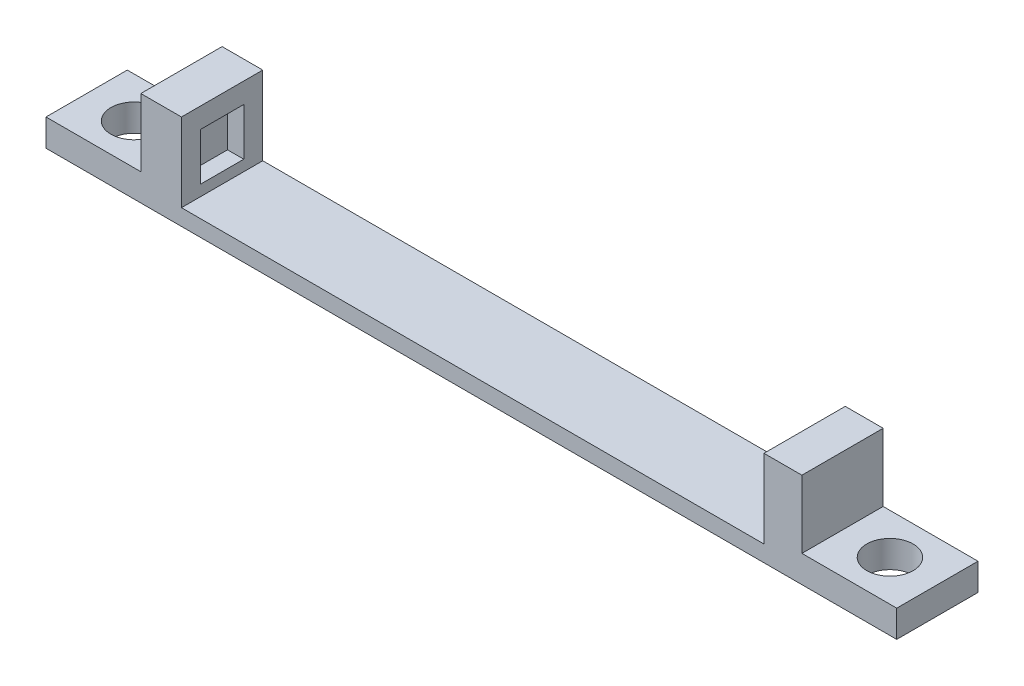
ISO-10303-21;
HEADER;
FILE_DESCRIPTION(('STEP AP214'),'2;1');
FILE_NAME('part.step','',(''),(''),'','','');
FILE_SCHEMA(('AUTOMOTIVE_DESIGN { 1 0 10303 214 1 1 1 1 }'));
ENDSEC;
DATA;
#1=APPLICATION_CONTEXT('core data for automotive mechanical design processes');
#2=APPLICATION_PROTOCOL_DEFINITION('international standard','automotive_design',2000,#1);
#3=PRODUCT_CONTEXT('',#1,'mechanical');
#4=PRODUCT('Part','Part','',(#3));
#5=PRODUCT_RELATED_PRODUCT_CATEGORY('part','',(#4));
#6=PRODUCT_DEFINITION_FORMATION('','',#4);
#7=PRODUCT_DEFINITION_CONTEXT('part definition',#1,'design');
#8=PRODUCT_DEFINITION('design','',#6,#7);
#9=PRODUCT_DEFINITION_SHAPE('','',#8);
#10=(LENGTH_UNIT() NAMED_UNIT(*) SI_UNIT(.MILLI.,.METRE.));
#11=(NAMED_UNIT(*) PLANE_ANGLE_UNIT() SI_UNIT($,.RADIAN.));
#12=(NAMED_UNIT(*) SI_UNIT($,.STERADIAN.) SOLID_ANGLE_UNIT());
#13=UNCERTAINTY_MEASURE_WITH_UNIT(LENGTH_MEASURE(1.E-05),#10,'distance_accuracy_value','');
#14=(GEOMETRIC_REPRESENTATION_CONTEXT(3) GLOBAL_UNCERTAINTY_ASSIGNED_CONTEXT((#13)) GLOBAL_UNIT_ASSIGNED_CONTEXT((#10,
#11,#12)) REPRESENTATION_CONTEXT('',''));
#15=CARTESIAN_POINT('',(0.,0.,0.));
#16=DIRECTION('',(0.,0.,1.));
#17=DIRECTION('',(1.,0.,0.));
#18=AXIS2_PLACEMENT_3D('',#15,#16,#17);
#19=CARTESIAN_POINT('',(53.3691636473072,1.524,5.87264658762612));
#20=DIRECTION('',(1.,0.,0.));
#21=DIRECTION('',(0.,0.,-1.));
#22=AXIS2_PLACEMENT_3D('',#19,#20,#21);
#23=PLANE('',#22);
#24=DIRECTION('',(0.,0.,-1.));
#25=VECTOR('',#24,1.);
#26=CARTESIAN_POINT('',(53.3691636473072,8.89,5.87264658762612));
#27=LINE('',#26,#25);
#28=CARTESIAN_POINT('',(53.3691636473072,8.89,13.4926465876261));
#29=VERTEX_POINT('',#28);
#30=CARTESIAN_POINT('',(53.3691636473072,8.89,5.87264658762612));
#31=VERTEX_POINT('',#30);
#32=EDGE_CURVE('E232',#29,#31,#27,.T.);
#33=ORIENTED_EDGE('',*,*,#32,.T.);
#34=DIRECTION('',(0.,1.,0.));
#35=VECTOR('',#34,1.);
#36=CARTESIAN_POINT('',(53.3691636473072,1.524,5.87264658762612));
#37=LINE('',#36,#35);
#38=CARTESIAN_POINT('',(53.3691636473072,1.524,5.87264658762612));
#39=VERTEX_POINT('',#38);
#40=EDGE_CURVE('E247',#39,#31,#37,.T.);
#41=ORIENTED_EDGE('',*,*,#40,.F.);
#42=DIRECTION('',(0.,0.,-1.));
#43=VECTOR('',#42,1.);
#44=CARTESIAN_POINT('',(53.3691636473072,1.524,5.87264658762612));
#45=LINE('',#44,#43);
#46=CARTESIAN_POINT('',(53.3691636473072,1.524,13.4926465876261));
#47=VERTEX_POINT('',#46);
#48=EDGE_CURVE('E235',#47,#39,#45,.T.);
#49=ORIENTED_EDGE('',*,*,#48,.F.);
#50=DIRECTION('',(0.,1.,0.));
#51=VECTOR('',#50,1.);
#52=CARTESIAN_POINT('',(53.3691636473072,1.524,13.4926465876261));
#53=LINE('',#52,#51);
#54=EDGE_CURVE('E250',#47,#29,#53,.T.);
#55=ORIENTED_EDGE('',*,*,#54,.T.);
#56=EDGE_LOOP('',(#33,#41,#49,#55));
#57=FACE_BOUND('',#56,.T.);
#58=DIRECTION('',(0.,-1.,0.));
#59=VECTOR('',#58,1.);
#60=CARTESIAN_POINT('',(53.3691636473072,6.985,7.84114658762612));
#61=LINE('',#60,#59);
#62=CARTESIAN_POINT('',(53.3691636473072,6.985,7.84114658762612));
#63=VERTEX_POINT('',#62);
#64=CARTESIAN_POINT('',(53.3691636473072,2.54,7.84114658762612));
#65=VERTEX_POINT('',#64);
#66=EDGE_CURVE('E189',#63,#65,#61,.T.);
#67=ORIENTED_EDGE('',*,*,#66,.F.);
#68=DIRECTION('',(0.,0.,-1.));
#69=VECTOR('',#68,1.);
#70=CARTESIAN_POINT('',(53.3691636473072,6.985,7.84114658762612));
#71=LINE('',#70,#69);
#72=CARTESIAN_POINT('',(53.3691636473072,6.985,11.5241465876261));
#73=VERTEX_POINT('',#72);
#74=EDGE_CURVE('E186',#73,#63,#71,.T.);
#75=ORIENTED_EDGE('',*,*,#74,.F.);
#76=DIRECTION('',(0.,1.,0.));
#77=VECTOR('',#76,1.);
#78=CARTESIAN_POINT('',(53.3691636473072,6.985,11.5241465876261));
#79=LINE('',#78,#77);
#80=CARTESIAN_POINT('',(53.3691636473072,2.54,11.5241465876261));
#81=VERTEX_POINT('',#80);
#82=EDGE_CURVE('E53',#81,#73,#79,.T.);
#83=ORIENTED_EDGE('',*,*,#82,.F.);
#84=DIRECTION('',(0.,0.,1.));
#85=VECTOR('',#84,1.);
#86=CARTESIAN_POINT('',(53.3691636473072,2.54,7.84114658762612));
#87=LINE('',#86,#85);
#88=EDGE_CURVE('E48',#65,#81,#87,.T.);
#89=ORIENTED_EDGE('',*,*,#88,.F.);
#90=EDGE_LOOP('',(#67,#75,#83,#89));
#91=FACE_BOUND('',#90,.T.);
#92=ADVANCED_FACE('F33',(#57,#91),#23,.F.);
#93=CARTESIAN_POINT('',(0.,8.89,0.));
#94=DIRECTION('',(0.,1.,0.));
#95=DIRECTION('',(0.,0.,1.));
#96=AXIS2_PLACEMENT_3D('',#93,#94,#95);
#97=PLANE('',#96);
#98=DIRECTION('',(0.,0.,1.));
#99=VECTOR('',#98,1.);
#100=CARTESIAN_POINT('',(-1.24083635269281,8.89,5.87264658762612));
#101=LINE('',#100,#99);
#102=CARTESIAN_POINT('',(-1.24083635269281,8.89,5.87264658762612));
#103=VERTEX_POINT('',#102);
#104=CARTESIAN_POINT('',(-1.2408363526928,8.89,13.4926465876261));
#105=VERTEX_POINT('',#104);
#106=EDGE_CURVE('E221',#103,#105,#101,.T.);
#107=ORIENTED_EDGE('',*,*,#106,.F.);
#108=DIRECTION('',(-1.,0.,0.));
#109=VECTOR('',#108,1.);
#110=CARTESIAN_POINT('',(-13.9408363526928,8.89,5.87264658762612));
#111=LINE('',#110,#109);
#112=CARTESIAN_POINT('',(-5.05083635269281,8.89,5.87264658762612));
#113=VERTEX_POINT('',#112);
#114=EDGE_CURVE('E293',#103,#113,#111,.T.);
#115=ORIENTED_EDGE('',*,*,#114,.T.);
#116=DIRECTION('',(0.,0.,-1.));
#117=VECTOR('',#116,1.);
#118=CARTESIAN_POINT('',(-5.05083635269281,8.89,5.87264658762612));
#119=LINE('',#118,#117);
#120=CARTESIAN_POINT('',(-5.05083635269281,8.89,13.4926465876261));
#121=VERTEX_POINT('',#120);
#122=EDGE_CURVE('E270',#121,#113,#119,.T.);
#123=ORIENTED_EDGE('',*,*,#122,.F.);
#124=DIRECTION('',(1.,0.,0.));
#125=VECTOR('',#124,1.);
#126=CARTESIAN_POINT('',(-13.9408363526928,8.89,13.4926465876261));
#127=LINE('',#126,#125);
#128=EDGE_CURVE('E290',#121,#105,#127,.T.);
#129=ORIENTED_EDGE('',*,*,#128,.T.);
#130=EDGE_LOOP('',(#107,#115,#123,#129));
#131=FACE_BOUND('',#130,.T.);
#132=ADVANCED_FACE('F358',(#131),#97,.T.);
#133=CARTESIAN_POINT('',(-13.9408363526928,8.89,5.87264658762612));
#134=DIRECTION('',(1.,0.,0.));
#135=DIRECTION('',(0.,0.,-1.));
#136=AXIS2_PLACEMENT_3D('',#133,#134,#135);
#137=PLANE('',#136);
#138=DIRECTION('',(0.,0.,1.));
#139=VECTOR('',#138,1.);
#140=CARTESIAN_POINT('',(-13.9408363526928,2.54,5.87264658762612));
#141=LINE('',#140,#139);
#142=CARTESIAN_POINT('',(-13.9408363526928,2.54,5.87264658762612));
#143=VERTEX_POINT('',#142);
#144=CARTESIAN_POINT('',(-13.9408363526928,2.54,13.4926465876261));
#145=VERTEX_POINT('',#144);
#146=EDGE_CURVE('E272',#143,#145,#141,.T.);
#147=ORIENTED_EDGE('',*,*,#146,.F.);
#148=DIRECTION('',(0.,-1.,0.));
#149=VECTOR('',#148,1.);
#150=CARTESIAN_POINT('',(-13.9408363526928,8.89,5.87264658762612));
#151=LINE('',#150,#149);
#152=CARTESIAN_POINT('',(-13.9408363526928,0.,5.87264658762612));
#153=VERTEX_POINT('',#152);
#154=EDGE_CURVE('E298',#143,#153,#151,.T.);
#155=ORIENTED_EDGE('',*,*,#154,.T.);
#156=DIRECTION('',(0.,0.,1.));
#157=VECTOR('',#156,1.);
#158=CARTESIAN_POINT('',(-13.9408363526928,0.,5.87264658762612));
#159=LINE('',#158,#157);
#160=CARTESIAN_POINT('',(-13.9408363526928,0.,13.4926465876261));
#161=VERTEX_POINT('',#160);
#162=EDGE_CURVE('E288',#153,#161,#159,.T.);
#163=ORIENTED_EDGE('',*,*,#162,.T.);
#164=DIRECTION('',(0.,-1.,0.));
#165=VECTOR('',#164,1.);
#166=CARTESIAN_POINT('',(-13.9408363526928,8.89,13.4926465876261));
#167=LINE('',#166,#165);
#168=EDGE_CURVE('E11',#145,#161,#167,.T.);
#169=ORIENTED_EDGE('',*,*,#168,.F.);
#170=EDGE_LOOP('',(#147,#155,#163,#169));
#171=FACE_BOUND('',#170,.T.);
#172=ADVANCED_FACE('F35',(#171),#137,.F.);
#173=CARTESIAN_POINT('',(-13.9408363526928,8.89,13.4926465876261));
#174=DIRECTION('',(0.,0.,-1.));
#175=DIRECTION('',(-1.,0.,0.));
#176=AXIS2_PLACEMENT_3D('',#173,#174,#175);
#177=PLANE('',#176);
#178=DIRECTION('',(1.,0.,0.));
#179=VECTOR('',#178,1.);
#180=CARTESIAN_POINT('',(-1.2408363526928,1.524,13.4926465876261));
#181=LINE('',#180,#179);
#182=CARTESIAN_POINT('',(-1.2408363526928,1.524,13.4926465876261));
#183=VERTEX_POINT('',#182);
#184=EDGE_CURVE('E231',#183,#47,#181,.T.);
#185=ORIENTED_EDGE('',*,*,#184,.F.);
#186=DIRECTION('',(0.,1.,0.));
#187=VECTOR('',#186,1.);
#188=CARTESIAN_POINT('',(-1.2408363526928,1.524,13.4926465876261));
#189=LINE('',#188,#187);
#190=EDGE_CURVE('E241',#183,#105,#189,.T.);
#191=ORIENTED_EDGE('',*,*,#190,.T.);
#192=ORIENTED_EDGE('',*,*,#128,.F.);
#193=DIRECTION('',(0.,1.,0.));
#194=VECTOR('',#193,1.);
#195=CARTESIAN_POINT('',(-5.05083635269281,2.54,13.4926465876261));
#196=LINE('',#195,#194);
#197=CARTESIAN_POINT('',(-5.05083635269281,2.54,13.4926465876261));
#198=VERTEX_POINT('',#197);
#199=EDGE_CURVE('E282',#198,#121,#196,.T.);
#200=ORIENTED_EDGE('',*,*,#199,.F.);
#201=DIRECTION('',(1.,0.,0.));
#202=VECTOR('',#201,1.);
#203=CARTESIAN_POINT('',(-13.9408363526928,2.54,13.4926465876261));
#204=LINE('',#203,#202);
#205=EDGE_CURVE('E274',#145,#198,#204,.T.);
#206=ORIENTED_EDGE('',*,*,#205,.F.);
#207=ORIENTED_EDGE('',*,*,#168,.T.);
#208=DIRECTION('',(1.,0.,0.));
#209=VECTOR('',#208,1.);
#210=CARTESIAN_POINT('',(-13.9408363526928,0.,13.4926465876261));
#211=LINE('',#210,#209);
#212=CARTESIAN_POINT('',(65.8151636473072,0.,13.4926465876261));
#213=VERTEX_POINT('',#212);
#214=EDGE_CURVE('E301',#161,#213,#211,.T.);
#215=ORIENTED_EDGE('',*,*,#214,.T.);
#216=DIRECTION('',(0.,-1.,0.));
#217=VECTOR('',#216,1.);
#218=CARTESIAN_POINT('',(65.8151636473072,8.89,13.4926465876261));
#219=LINE('',#218,#217);
#220=CARTESIAN_POINT('',(65.8151636473072,2.54,13.4926465876261));
#221=VERTEX_POINT('',#220);
#222=EDGE_CURVE('E41',#221,#213,#219,.T.);
#223=ORIENTED_EDGE('',*,*,#222,.F.);
#224=DIRECTION('',(1.,0.,0.));
#225=VECTOR('',#224,1.);
#226=CARTESIAN_POINT('',(65.8151636473072,2.54,13.4926465876261));
#227=LINE('',#226,#225);
#228=CARTESIAN_POINT('',(56.9251636473072,2.54,13.4926465876261));
#229=VERTEX_POINT('',#228);
#230=EDGE_CURVE('E262',#229,#221,#227,.T.);
#231=ORIENTED_EDGE('',*,*,#230,.F.);
#232=DIRECTION('',(0.,1.,0.));
#233=VECTOR('',#232,1.);
#234=CARTESIAN_POINT('',(56.9251636473072,2.54,13.4926465876261));
#235=LINE('',#234,#233);
#236=CARTESIAN_POINT('',(56.9251636473072,8.89,13.4926465876261));
#237=VERTEX_POINT('',#236);
#238=EDGE_CURVE('E267',#229,#237,#235,.T.);
#239=ORIENTED_EDGE('',*,*,#238,.T.);
#240=EDGE_CURVE('E294',#29,#237,#127,.T.);
#241=ORIENTED_EDGE('',*,*,#240,.F.);
#242=ORIENTED_EDGE('',*,*,#54,.F.);
#243=EDGE_LOOP('',(#185,#191,#192,#200,#206,#207,#215,#223,#231,#239,#241,#242));
#244=FACE_BOUND('',#243,.T.);
#245=ADVANCED_FACE('F323',(#244),#177,.F.);
#246=CARTESIAN_POINT('',(65.8151636473072,8.89,5.87264658762612));
#247=DIRECTION('',(-1.,0.,0.));
#248=DIRECTION('',(0.,0.,1.));
#249=AXIS2_PLACEMENT_3D('',#246,#247,#248);
#250=PLANE('',#249);
#251=DIRECTION('',(0.,-1.,0.));
#252=VECTOR('',#251,1.);
#253=CARTESIAN_POINT('',(65.8151636473072,8.89,5.87264658762612));
#254=LINE('',#253,#252);
#255=CARTESIAN_POINT('',(65.8151636473072,2.54,5.87264658762612));
#256=VERTEX_POINT('',#255);
#257=CARTESIAN_POINT('',(65.8151636473072,0.,5.87264658762612));
#258=VERTEX_POINT('',#257);
#259=EDGE_CURVE('E311',#256,#258,#254,.T.);
#260=ORIENTED_EDGE('',*,*,#259,.F.);
#261=DIRECTION('',(0.,0.,-1.));
#262=VECTOR('',#261,1.);
#263=CARTESIAN_POINT('',(65.8151636473072,2.54,5.87264658762612));
#264=LINE('',#263,#262);
#265=EDGE_CURVE('E254',#221,#256,#264,.T.);
#266=ORIENTED_EDGE('',*,*,#265,.F.);
#267=ORIENTED_EDGE('',*,*,#222,.T.);
#268=DIRECTION('',(0.,0.,-1.));
#269=VECTOR('',#268,1.);
#270=CARTESIAN_POINT('',(65.8151636473072,0.,5.87264658762612));
#271=LINE('',#270,#269);
#272=EDGE_CURVE('E304',#213,#258,#271,.T.);
#273=ORIENTED_EDGE('',*,*,#272,.T.);
#274=EDGE_LOOP('',(#260,#266,#267,#273));
#275=FACE_BOUND('',#274,.T.);
#276=ADVANCED_FACE('F316',(#275),#250,.F.);
#277=CARTESIAN_POINT('',(-13.9408363526928,8.89,5.87264658762612));
#278=DIRECTION('',(0.,0.,1.));
#279=DIRECTION('',(1.,0.,0.));
#280=AXIS2_PLACEMENT_3D('',#277,#278,#279);
#281=PLANE('',#280);
#282=ORIENTED_EDGE('',*,*,#114,.F.);
#283=DIRECTION('',(0.,1.,0.));
#284=VECTOR('',#283,1.);
#285=CARTESIAN_POINT('',(-1.24083635269281,1.524,5.87264658762612));
#286=LINE('',#285,#284);
#287=CARTESIAN_POINT('',(-1.24083635269281,1.524,5.87264658762612));
#288=VERTEX_POINT('',#287);
#289=EDGE_CURVE('E244',#288,#103,#286,.T.);
#290=ORIENTED_EDGE('',*,*,#289,.F.);
#291=DIRECTION('',(-1.,0.,0.));
#292=VECTOR('',#291,1.);
#293=CARTESIAN_POINT('',(-1.24083635269281,1.524,5.87264658762612));
#294=LINE('',#293,#292);
#295=EDGE_CURVE('E238',#39,#288,#294,.T.);
#296=ORIENTED_EDGE('',*,*,#295,.F.);
#297=ORIENTED_EDGE('',*,*,#40,.T.);
#298=CARTESIAN_POINT('',(56.9251636473072,8.89,5.87264658762612));
#299=VERTEX_POINT('',#298);
#300=EDGE_CURVE('E295',#299,#31,#111,.T.);
#301=ORIENTED_EDGE('',*,*,#300,.F.);
#302=DIRECTION('',(0.,1.,0.));
#303=VECTOR('',#302,1.);
#304=CARTESIAN_POINT('',(56.9251636473072,2.54,5.87264658762612));
#305=LINE('',#304,#303);
#306=CARTESIAN_POINT('',(56.9251636473072,2.54,5.87264658762612));
#307=VERTEX_POINT('',#306);
#308=EDGE_CURVE('E264',#307,#299,#305,.T.);
#309=ORIENTED_EDGE('',*,*,#308,.F.);
#310=DIRECTION('',(-1.,0.,0.));
#311=VECTOR('',#310,1.);
#312=CARTESIAN_POINT('',(65.8151636473072,2.54,5.87264658762612));
#313=LINE('',#312,#311);
#314=EDGE_CURVE('E256',#256,#307,#313,.T.);
#315=ORIENTED_EDGE('',*,*,#314,.F.);
#316=ORIENTED_EDGE('',*,*,#259,.T.);
#317=DIRECTION('',(-1.,0.,0.));
#318=VECTOR('',#317,1.);
#319=CARTESIAN_POINT('',(-13.9408363526928,0.,5.87264658762612));
#320=LINE('',#319,#318);
#321=EDGE_CURVE('E307',#258,#153,#320,.T.);
#322=ORIENTED_EDGE('',*,*,#321,.T.);
#323=ORIENTED_EDGE('',*,*,#154,.F.);
#324=DIRECTION('',(-1.,0.,0.));
#325=VECTOR('',#324,1.);
#326=CARTESIAN_POINT('',(-13.9408363526928,2.54,5.87264658762612));
#327=LINE('',#326,#325);
#328=CARTESIAN_POINT('',(-5.05083635269281,2.54,5.87264658762612));
#329=VERTEX_POINT('',#328);
#330=EDGE_CURVE('E280',#329,#143,#327,.T.);
#331=ORIENTED_EDGE('',*,*,#330,.F.);
#332=DIRECTION('',(0.,1.,0.));
#333=VECTOR('',#332,1.);
#334=CARTESIAN_POINT('',(-5.05083635269281,2.54,5.87264658762612));
#335=LINE('',#334,#333);
#336=EDGE_CURVE('E285',#329,#113,#335,.T.);
#337=ORIENTED_EDGE('',*,*,#336,.T.);
#338=EDGE_LOOP('',(#282,#290,#296,#297,#301,#309,#315,#316,#322,#323,#331,#337));
#339=FACE_BOUND('',#338,.T.);
#340=ADVANCED_FACE('F332',(#339),#281,.F.);
#341=ORIENTED_EDGE('',*,*,#32,.F.);
#342=ORIENTED_EDGE('',*,*,#240,.T.);
#343=DIRECTION('',(0.,0.,1.));
#344=VECTOR('',#343,1.);
#345=CARTESIAN_POINT('',(56.9251636473072,8.89,5.87264658762612));
#346=LINE('',#345,#344);
#347=EDGE_CURVE('E246',#299,#237,#346,.T.);
#348=ORIENTED_EDGE('',*,*,#347,.F.);
#349=ORIENTED_EDGE('',*,*,#300,.T.);
#350=EDGE_LOOP('',(#341,#342,#348,#349));
#351=FACE_BOUND('',#350,.T.);
#352=ADVANCED_FACE('F346',(#351),#97,.T.);
#353=CARTESIAN_POINT('',(0.,0.,0.));
#354=DIRECTION('',(0.,1.,0.));
#355=DIRECTION('',(0.,0.,1.));
#356=AXIS2_PLACEMENT_3D('',#353,#354,#355);
#357=PLANE('',#356);
#358=CARTESIAN_POINT('',(61.3701636473072,0.,9.68264658762611));
#359=DIRECTION('',(0.,1.,0.));
#360=DIRECTION('',(0.,0.,1.));
#361=AXIS2_PLACEMENT_3D('',#358,#359,#360);
#362=CIRCLE('',#361,2.17169999999999);
#363=CARTESIAN_POINT('',(61.3701636473072,0.,11.8543465876261));
#364=VERTEX_POINT('',#363);
#365=EDGE_CURVE('E596',#364,#364,#362,.T.);
#366=ORIENTED_EDGE('',*,*,#365,.T.);
#367=EDGE_LOOP('',(#366));
#368=FACE_BOUND('',#367,.T.);
#369=CARTESIAN_POINT('',(-9.49583635269281,0.,9.68264658762611));
#370=DIRECTION('',(0.,1.,0.));
#371=DIRECTION('',(0.,0.,1.));
#372=AXIS2_PLACEMENT_3D('',#369,#370,#371);
#373=CIRCLE('',#372,2.1717);
#374=CARTESIAN_POINT('',(-9.49583635269281,0.,11.8543465876261));
#375=VERTEX_POINT('',#374);
#376=EDGE_CURVE('E604',#375,#375,#373,.T.);
#377=ORIENTED_EDGE('',*,*,#376,.T.);
#378=EDGE_LOOP('',(#377));
#379=FACE_BOUND('',#378,.T.);
#380=ORIENTED_EDGE('',*,*,#162,.F.);
#381=ORIENTED_EDGE('',*,*,#321,.F.);
#382=ORIENTED_EDGE('',*,*,#272,.F.);
#383=ORIENTED_EDGE('',*,*,#214,.F.);
#384=EDGE_LOOP('',(#380,#381,#382,#383));
#385=FACE_BOUND('',#384,.T.);
#386=ADVANCED_FACE('F328',(#368,#379,#385),#357,.F.);
#387=CARTESIAN_POINT('',(-5.05083635269281,2.54,5.87264658762612));
#388=DIRECTION('',(1.,0.,0.));
#389=DIRECTION('',(0.,0.,-1.));
#390=AXIS2_PLACEMENT_3D('',#387,#388,#389);
#391=PLANE('',#390);
#392=ORIENTED_EDGE('',*,*,#122,.T.);
#393=ORIENTED_EDGE('',*,*,#336,.F.);
#394=DIRECTION('',(0.,0.,-1.));
#395=VECTOR('',#394,1.);
#396=CARTESIAN_POINT('',(-5.05083635269281,2.54,5.87264658762612));
#397=LINE('',#396,#395);
#398=EDGE_CURVE('E277',#198,#329,#397,.T.);
#399=ORIENTED_EDGE('',*,*,#398,.F.);
#400=ORIENTED_EDGE('',*,*,#199,.T.);
#401=EDGE_LOOP('',(#392,#393,#399,#400));
#402=FACE_BOUND('',#401,.T.);
#403=ADVANCED_FACE('F360',(#402),#391,.F.);
#404=CARTESIAN_POINT('',(0.,2.54,0.));
#405=DIRECTION('',(0.,1.,0.));
#406=DIRECTION('',(0.,0.,1.));
#407=AXIS2_PLACEMENT_3D('',#404,#405,#406);
#408=PLANE('',#407);
#409=CARTESIAN_POINT('',(-9.49583635269281,2.54,9.68264658762611));
#410=DIRECTION('',(0.,1.,0.));
#411=DIRECTION('',(0.,0.,1.));
#412=AXIS2_PLACEMENT_3D('',#409,#410,#411);
#413=CIRCLE('',#412,2.1717);
#414=CARTESIAN_POINT('',(-9.49583635269281,2.54,11.8543465876261));
#415=VERTEX_POINT('',#414);
#416=EDGE_CURVE('E601',#415,#415,#413,.T.);
#417=ORIENTED_EDGE('',*,*,#416,.F.);
#418=EDGE_LOOP('',(#417));
#419=FACE_BOUND('',#418,.T.);
#420=ORIENTED_EDGE('',*,*,#146,.T.);
#421=ORIENTED_EDGE('',*,*,#205,.T.);
#422=ORIENTED_EDGE('',*,*,#398,.T.);
#423=ORIENTED_EDGE('',*,*,#330,.T.);
#424=EDGE_LOOP('',(#420,#421,#422,#423));
#425=FACE_BOUND('',#424,.T.);
#426=ADVANCED_FACE('F363',(#419,#425),#408,.T.);
#427=CARTESIAN_POINT('',(56.9251636473072,2.54,5.87264658762612));
#428=DIRECTION('',(-1.,0.,0.));
#429=DIRECTION('',(0.,0.,1.));
#430=AXIS2_PLACEMENT_3D('',#427,#428,#429);
#431=PLANE('',#430);
#432=ORIENTED_EDGE('',*,*,#347,.T.);
#433=ORIENTED_EDGE('',*,*,#238,.F.);
#434=DIRECTION('',(0.,0.,1.));
#435=VECTOR('',#434,1.);
#436=CARTESIAN_POINT('',(56.9251636473072,2.54,5.87264658762612));
#437=LINE('',#436,#435);
#438=EDGE_CURVE('E259',#307,#229,#437,.T.);
#439=ORIENTED_EDGE('',*,*,#438,.F.);
#440=ORIENTED_EDGE('',*,*,#308,.T.);
#441=EDGE_LOOP('',(#432,#433,#439,#440));
#442=FACE_BOUND('',#441,.T.);
#443=ADVANCED_FACE('F342',(#442),#431,.F.);
#444=CARTESIAN_POINT('',(0.,2.54,0.));
#445=DIRECTION('',(0.,-1.,0.));
#446=DIRECTION('',(0.,0.,-1.));
#447=AXIS2_PLACEMENT_3D('',#444,#445,#446);
#448=PLANE('',#447);
#449=CARTESIAN_POINT('',(61.3701636473072,2.54,9.68264658762611));
#450=DIRECTION('',(0.,1.,0.));
#451=DIRECTION('',(0.,0.,1.));
#452=AXIS2_PLACEMENT_3D('',#449,#450,#451);
#453=CIRCLE('',#452,2.17169999999999);
#454=CARTESIAN_POINT('',(61.3701636473072,2.54,11.8543465876261));
#455=VERTEX_POINT('',#454);
#456=EDGE_CURVE('E599',#455,#455,#453,.T.);
#457=ORIENTED_EDGE('',*,*,#456,.F.);
#458=EDGE_LOOP('',(#457));
#459=FACE_BOUND('',#458,.T.);
#460=ORIENTED_EDGE('',*,*,#265,.T.);
#461=ORIENTED_EDGE('',*,*,#314,.T.);
#462=ORIENTED_EDGE('',*,*,#438,.T.);
#463=ORIENTED_EDGE('',*,*,#230,.T.);
#464=EDGE_LOOP('',(#460,#461,#462,#463));
#465=FACE_BOUND('',#464,.T.);
#466=ADVANCED_FACE('F338',(#459,#465),#448,.F.);
#467=CARTESIAN_POINT('',(-1.24083635269281,1.524,5.87264658762612));
#468=DIRECTION('',(-1.,0.,0.));
#469=DIRECTION('',(0.,0.,1.));
#470=AXIS2_PLACEMENT_3D('',#467,#468,#469);
#471=PLANE('',#470);
#472=DIRECTION('',(0.,0.,-1.));
#473=VECTOR('',#472,1.);
#474=CARTESIAN_POINT('',(-1.24083635269281,2.54,11.7146465876261));
#475=LINE('',#474,#473);
#476=CARTESIAN_POINT('',(-1.24083635269281,2.54,11.7146465876261));
#477=VERTEX_POINT('',#476);
#478=CARTESIAN_POINT('',(-1.24083635269281,2.54,7.65064658762611));
#479=VERTEX_POINT('',#478);
#480=EDGE_CURVE('E192',#477,#479,#475,.T.);
#481=ORIENTED_EDGE('',*,*,#480,.F.);
#482=DIRECTION('',(0.,-1.,0.));
#483=VECTOR('',#482,1.);
#484=CARTESIAN_POINT('',(-1.24083635269281,6.985,11.7146465876261));
#485=LINE('',#484,#483);
#486=CARTESIAN_POINT('',(-1.24083635269281,6.985,11.7146465876261));
#487=VERTEX_POINT('',#486);
#488=EDGE_CURVE('E190',#487,#477,#485,.T.);
#489=ORIENTED_EDGE('',*,*,#488,.F.);
#490=DIRECTION('',(0.,0.,1.));
#491=VECTOR('',#490,1.);
#492=CARTESIAN_POINT('',(-1.24083635269281,6.985,11.7146465876261));
#493=LINE('',#492,#491);
#494=CARTESIAN_POINT('',(-1.24083635269281,6.985,7.65064658762611));
#495=VERTEX_POINT('',#494);
#496=EDGE_CURVE('E202',#495,#487,#493,.T.);
#497=ORIENTED_EDGE('',*,*,#496,.F.);
#498=DIRECTION('',(0.,1.,0.));
#499=VECTOR('',#498,1.);
#500=CARTESIAN_POINT('',(-1.24083635269281,6.985,7.65064658762611));
#501=LINE('',#500,#499);
#502=EDGE_CURVE('E214',#479,#495,#501,.T.);
#503=ORIENTED_EDGE('',*,*,#502,.F.);
#504=EDGE_LOOP('',(#481,#489,#497,#503));
#505=FACE_BOUND('',#504,.T.);
#506=ORIENTED_EDGE('',*,*,#106,.T.);
#507=ORIENTED_EDGE('',*,*,#190,.F.);
#508=DIRECTION('',(0.,0.,1.));
#509=VECTOR('',#508,1.);
#510=CARTESIAN_POINT('',(-1.24083635269281,1.524,5.87264658762612));
#511=LINE('',#510,#509);
#512=EDGE_CURVE('E228',#288,#183,#511,.T.);
#513=ORIENTED_EDGE('',*,*,#512,.F.);
#514=ORIENTED_EDGE('',*,*,#289,.T.);
#515=EDGE_LOOP('',(#506,#507,#513,#514));
#516=FACE_BOUND('',#515,.T.);
#517=ADVANCED_FACE('F378',(#505,#516),#471,.F.);
#518=CARTESIAN_POINT('',(0.,1.524,0.));
#519=DIRECTION('',(0.,1.,0.));
#520=DIRECTION('',(0.,0.,1.));
#521=AXIS2_PLACEMENT_3D('',#518,#519,#520);
#522=PLANE('',#521);
#523=ORIENTED_EDGE('',*,*,#512,.T.);
#524=ORIENTED_EDGE('',*,*,#184,.T.);
#525=ORIENTED_EDGE('',*,*,#48,.T.);
#526=ORIENTED_EDGE('',*,*,#295,.T.);
#527=EDGE_LOOP('',(#523,#524,#525,#526));
#528=FACE_BOUND('',#527,.T.);
#529=ADVANCED_FACE('F351',(#528),#522,.T.);
#530=CARTESIAN_POINT('',(-2.76483635269281,6.985,11.7146465876261));
#531=DIRECTION('',(0.,0.,1.));
#532=DIRECTION('',(1.,0.,0.));
#533=AXIS2_PLACEMENT_3D('',#530,#531,#532);
#534=PLANE('',#533);
#535=ORIENTED_EDGE('',*,*,#488,.T.);
#536=DIRECTION('',(1.,0.,0.));
#537=VECTOR('',#536,1.);
#538=CARTESIAN_POINT('',(-2.76483635269281,2.54,11.7146465876261));
#539=LINE('',#538,#537);
#540=CARTESIAN_POINT('',(-2.76483635269281,2.54,11.7146465876261));
#541=VERTEX_POINT('',#540);
#542=EDGE_CURVE('E210',#541,#477,#539,.T.);
#543=ORIENTED_EDGE('',*,*,#542,.F.);
#544=DIRECTION('',(0.,-1.,0.));
#545=VECTOR('',#544,1.);
#546=CARTESIAN_POINT('',(-2.76483635269281,6.985,11.7146465876261));
#547=LINE('',#546,#545);
#548=CARTESIAN_POINT('',(-2.76483635269281,6.985,11.7146465876261));
#549=VERTEX_POINT('',#548);
#550=EDGE_CURVE('E198',#549,#541,#547,.T.);
#551=ORIENTED_EDGE('',*,*,#550,.F.);
#552=DIRECTION('',(1.,0.,0.));
#553=VECTOR('',#552,1.);
#554=CARTESIAN_POINT('',(-2.76483635269281,6.985,11.7146465876261));
#555=LINE('',#554,#553);
#556=EDGE_CURVE('E219',#549,#487,#555,.T.);
#557=ORIENTED_EDGE('',*,*,#556,.T.);
#558=EDGE_LOOP('',(#535,#543,#551,#557));
#559=FACE_BOUND('',#558,.T.);
#560=ADVANCED_FACE('F446',(#559),#534,.F.);
#561=CARTESIAN_POINT('',(-2.76483635269281,6.985,11.7146465876261));
#562=DIRECTION('',(0.,1.,0.));
#563=DIRECTION('',(0.,0.,1.));
#564=AXIS2_PLACEMENT_3D('',#561,#562,#563);
#565=PLANE('',#564);
#566=ORIENTED_EDGE('',*,*,#496,.T.);
#567=ORIENTED_EDGE('',*,*,#556,.F.);
#568=DIRECTION('',(0.,0.,1.));
#569=VECTOR('',#568,1.);
#570=CARTESIAN_POINT('',(-2.76483635269281,6.985,11.7146465876261));
#571=LINE('',#570,#569);
#572=CARTESIAN_POINT('',(-2.76483635269281,6.985,7.65064658762611));
#573=VERTEX_POINT('',#572);
#574=EDGE_CURVE('E208',#573,#549,#571,.T.);
#575=ORIENTED_EDGE('',*,*,#574,.F.);
#576=DIRECTION('',(1.,0.,0.));
#577=VECTOR('',#576,1.);
#578=CARTESIAN_POINT('',(-2.76483635269281,6.985,7.65064658762611));
#579=LINE('',#578,#577);
#580=EDGE_CURVE('E222',#573,#495,#579,.T.);
#581=ORIENTED_EDGE('',*,*,#580,.T.);
#582=EDGE_LOOP('',(#566,#567,#575,#581));
#583=FACE_BOUND('',#582,.T.);
#584=ADVANCED_FACE('F451',(#583),#565,.F.);
#585=CARTESIAN_POINT('',(-2.76483635269281,6.985,7.65064658762611));
#586=DIRECTION('',(0.,0.,-1.));
#587=DIRECTION('',(-1.,0.,0.));
#588=AXIS2_PLACEMENT_3D('',#585,#586,#587);
#589=PLANE('',#588);
#590=ORIENTED_EDGE('',*,*,#502,.T.);
#591=ORIENTED_EDGE('',*,*,#580,.F.);
#592=DIRECTION('',(0.,1.,0.));
#593=VECTOR('',#592,1.);
#594=CARTESIAN_POINT('',(-2.76483635269281,6.985,7.65064658762611));
#595=LINE('',#594,#593);
#596=CARTESIAN_POINT('',(-2.76483635269281,2.54,7.65064658762611));
#597=VERTEX_POINT('',#596);
#598=EDGE_CURVE('E205',#597,#573,#595,.T.);
#599=ORIENTED_EDGE('',*,*,#598,.F.);
#600=DIRECTION('',(1.,0.,0.));
#601=VECTOR('',#600,1.);
#602=CARTESIAN_POINT('',(-2.76483635269281,2.54,7.65064658762611));
#603=LINE('',#602,#601);
#604=EDGE_CURVE('E224',#597,#479,#603,.T.);
#605=ORIENTED_EDGE('',*,*,#604,.T.);
#606=EDGE_LOOP('',(#590,#591,#599,#605));
#607=FACE_BOUND('',#606,.T.);
#608=ADVANCED_FACE('F458',(#607),#589,.F.);
#609=CARTESIAN_POINT('',(-2.76483635269281,2.54,11.7146465876261));
#610=DIRECTION('',(0.,-1.,0.));
#611=DIRECTION('',(0.,0.,-1.));
#612=AXIS2_PLACEMENT_3D('',#609,#610,#611);
#613=PLANE('',#612);
#614=ORIENTED_EDGE('',*,*,#480,.T.);
#615=ORIENTED_EDGE('',*,*,#604,.F.);
#616=DIRECTION('',(0.,0.,-1.));
#617=VECTOR('',#616,1.);
#618=CARTESIAN_POINT('',(-2.76483635269281,2.54,11.7146465876261));
#619=LINE('',#618,#617);
#620=EDGE_CURVE('E201',#541,#597,#619,.T.);
#621=ORIENTED_EDGE('',*,*,#620,.F.);
#622=ORIENTED_EDGE('',*,*,#542,.T.);
#623=EDGE_LOOP('',(#614,#615,#621,#622));
#624=FACE_BOUND('',#623,.T.);
#625=ADVANCED_FACE('F466',(#624),#613,.F.);
#626=CARTESIAN_POINT('',(-2.76483635269281,0.,0.));
#627=DIRECTION('',(1.,0.,0.));
#628=DIRECTION('',(0.,0.,-1.));
#629=AXIS2_PLACEMENT_3D('',#626,#627,#628);
#630=PLANE('',#629);
#631=ORIENTED_EDGE('',*,*,#550,.T.);
#632=ORIENTED_EDGE('',*,*,#620,.T.);
#633=ORIENTED_EDGE('',*,*,#598,.T.);
#634=ORIENTED_EDGE('',*,*,#574,.T.);
#635=EDGE_LOOP('',(#631,#632,#633,#634));
#636=FACE_BOUND('',#635,.T.);
#637=ADVANCED_FACE('F474',(#636),#630,.T.);
#638=CARTESIAN_POINT('',(51.8451636473072,6.985,7.84114658762612));
#639=DIRECTION('',(0.,0.,1.));
#640=DIRECTION('',(1.,0.,0.));
#641=AXIS2_PLACEMENT_3D('',#638,#639,#640);
#642=PLANE('',#641);
#643=ORIENTED_EDGE('',*,*,#66,.T.);
#644=DIRECTION('',(1.,0.,0.));
#645=VECTOR('',#644,1.);
#646=CARTESIAN_POINT('',(51.8451636473072,2.54,7.84114658762612));
#647=LINE('',#646,#645);
#648=CARTESIAN_POINT('',(51.8451636473072,2.54,7.84114658762612));
#649=VERTEX_POINT('',#648);
#650=EDGE_CURVE('E170',#649,#65,#647,.T.);
#651=ORIENTED_EDGE('',*,*,#650,.F.);
#652=DIRECTION('',(0.,-1.,0.));
#653=VECTOR('',#652,1.);
#654=CARTESIAN_POINT('',(51.8451636473072,6.985,7.84114658762612));
#655=LINE('',#654,#653);
#656=CARTESIAN_POINT('',(51.8451636473072,6.985,7.84114658762612));
#657=VERTEX_POINT('',#656);
#658=EDGE_CURVE('E177',#657,#649,#655,.T.);
#659=ORIENTED_EDGE('',*,*,#658,.F.);
#660=DIRECTION('',(1.,0.,0.));
#661=VECTOR('',#660,1.);
#662=CARTESIAN_POINT('',(51.8451636473072,6.985,7.84114658762612));
#663=LINE('',#662,#661);
#664=EDGE_CURVE('E611',#657,#63,#663,.T.);
#665=ORIENTED_EDGE('',*,*,#664,.T.);
#666=EDGE_LOOP('',(#643,#651,#659,#665));
#667=FACE_BOUND('',#666,.T.);
#668=ADVANCED_FACE('F188',(#667),#642,.F.);
#669=CARTESIAN_POINT('',(51.8451636473072,2.54,7.84114658762612));
#670=DIRECTION('',(0.,1.,0.));
#671=DIRECTION('',(0.,0.,1.));
#672=AXIS2_PLACEMENT_3D('',#669,#670,#671);
#673=PLANE('',#672);
#674=ORIENTED_EDGE('',*,*,#88,.T.);
#675=DIRECTION('',(1.,0.,0.));
#676=VECTOR('',#675,1.);
#677=CARTESIAN_POINT('',(51.8451636473072,2.54,11.5241465876261));
#678=LINE('',#677,#676);
#679=CARTESIAN_POINT('',(51.8451636473072,2.54,11.5241465876261));
#680=VERTEX_POINT('',#679);
#681=EDGE_CURVE('E173',#680,#81,#678,.T.);
#682=ORIENTED_EDGE('',*,*,#681,.F.);
#683=DIRECTION('',(0.,0.,1.));
#684=VECTOR('',#683,1.);
#685=CARTESIAN_POINT('',(51.8451636473072,2.54,7.84114658762612));
#686=LINE('',#685,#684);
#687=EDGE_CURVE('E166',#649,#680,#686,.T.);
#688=ORIENTED_EDGE('',*,*,#687,.F.);
#689=ORIENTED_EDGE('',*,*,#650,.T.);
#690=EDGE_LOOP('',(#674,#682,#688,#689));
#691=FACE_BOUND('',#690,.T.);
#692=ADVANCED_FACE('F168',(#691),#673,.F.);
#693=CARTESIAN_POINT('',(51.8451636473072,6.985,11.5241465876261));
#694=DIRECTION('',(0.,0.,-1.));
#695=DIRECTION('',(0.,1.,0.));
#696=AXIS2_PLACEMENT_3D('',#693,#694,#695);
#697=PLANE('',#696);
#698=ORIENTED_EDGE('',*,*,#82,.T.);
#699=DIRECTION('',(1.,0.,0.));
#700=VECTOR('',#699,1.);
#701=CARTESIAN_POINT('',(51.8451636473072,6.985,11.5241465876261));
#702=LINE('',#701,#700);
#703=CARTESIAN_POINT('',(51.8451636473072,6.985,11.5241465876261));
#704=VERTEX_POINT('',#703);
#705=EDGE_CURVE('E194',#704,#73,#702,.T.);
#706=ORIENTED_EDGE('',*,*,#705,.F.);
#707=DIRECTION('',(0.,1.,0.));
#708=VECTOR('',#707,1.);
#709=CARTESIAN_POINT('',(51.8451636473072,6.985,11.5241465876261));
#710=LINE('',#709,#708);
#711=EDGE_CURVE('E176',#680,#704,#710,.T.);
#712=ORIENTED_EDGE('',*,*,#711,.F.);
#713=ORIENTED_EDGE('',*,*,#681,.T.);
#714=EDGE_LOOP('',(#698,#706,#712,#713));
#715=FACE_BOUND('',#714,.T.);
#716=ADVANCED_FACE('F495',(#715),#697,.F.);
#717=CARTESIAN_POINT('',(51.8451636473072,6.985,7.84114658762612));
#718=DIRECTION('',(0.,-1.,0.));
#719=DIRECTION('',(0.,0.,-1.));
#720=AXIS2_PLACEMENT_3D('',#717,#718,#719);
#721=PLANE('',#720);
#722=ORIENTED_EDGE('',*,*,#74,.T.);
#723=ORIENTED_EDGE('',*,*,#664,.F.);
#724=DIRECTION('',(0.,0.,-1.));
#725=VECTOR('',#724,1.);
#726=CARTESIAN_POINT('',(51.8451636473072,6.985,7.84114658762612));
#727=LINE('',#726,#725);
#728=EDGE_CURVE('E182',#704,#657,#727,.T.);
#729=ORIENTED_EDGE('',*,*,#728,.F.);
#730=ORIENTED_EDGE('',*,*,#705,.T.);
#731=EDGE_LOOP('',(#722,#723,#729,#730));
#732=FACE_BOUND('',#731,.T.);
#733=ADVANCED_FACE('F502',(#732),#721,.F.);
#734=CARTESIAN_POINT('',(51.8451636473072,0.,0.));
#735=DIRECTION('',(-1.,0.,0.));
#736=DIRECTION('',(0.,0.,1.));
#737=AXIS2_PLACEMENT_3D('',#734,#735,#736);
#738=PLANE('',#737);
#739=ORIENTED_EDGE('',*,*,#658,.T.);
#740=ORIENTED_EDGE('',*,*,#687,.T.);
#741=ORIENTED_EDGE('',*,*,#711,.T.);
#742=ORIENTED_EDGE('',*,*,#728,.T.);
#743=EDGE_LOOP('',(#739,#740,#741,#742));
#744=FACE_BOUND('',#743,.T.);
#745=ADVANCED_FACE('F180',(#744),#738,.T.);
#746=CARTESIAN_POINT('',(-9.49583635269281,0.,9.68264658762611));
#747=DIRECTION('',(0.,1.,0.));
#748=DIRECTION('',(0.,0.,1.));
#749=AXIS2_PLACEMENT_3D('',#746,#747,#748);
#750=CYLINDRICAL_SURFACE('',#749,2.1717);
#751=ORIENTED_EDGE('',*,*,#376,.F.);
#752=EDGE_LOOP('',(#751));
#753=FACE_BOUND('',#752,.T.);
#754=ORIENTED_EDGE('',*,*,#416,.T.);
#755=EDGE_LOOP('',(#754));
#756=FACE_BOUND('',#755,.T.);
#757=ADVANCED_FACE('F516',(#753,#756),#750,.F.);
#758=CARTESIAN_POINT('',(61.3701636473072,0.,9.68264658762611));
#759=DIRECTION('',(0.,1.,0.));
#760=DIRECTION('',(0.,0.,1.));
#761=AXIS2_PLACEMENT_3D('',#758,#759,#760);
#762=CYLINDRICAL_SURFACE('',#761,2.17169999999999);
#763=ORIENTED_EDGE('',*,*,#365,.F.);
#764=EDGE_LOOP('',(#763));
#765=FACE_BOUND('',#764,.T.);
#766=ORIENTED_EDGE('',*,*,#456,.T.);
#767=EDGE_LOOP('',(#766));
#768=FACE_BOUND('',#767,.T.);
#769=ADVANCED_FACE('F522',(#765,#768),#762,.F.);
#770=CLOSED_SHELL('',(#92,#132,#172,#245,#276,#340,#352,#386,#403,#426,#443,#466,#517,#529,#560,
#584,#608,#625,#637,#668,#692,#716,#733,#745,#757,#769));
#771=MANIFOLD_SOLID_BREP('B2',#770);
#772=ADVANCED_BREP_SHAPE_REPRESENTATION('',(#18,#771),#14);
#773=SHAPE_DEFINITION_REPRESENTATION(#9,#772);
ENDSEC;
END-ISO-10303-21;
